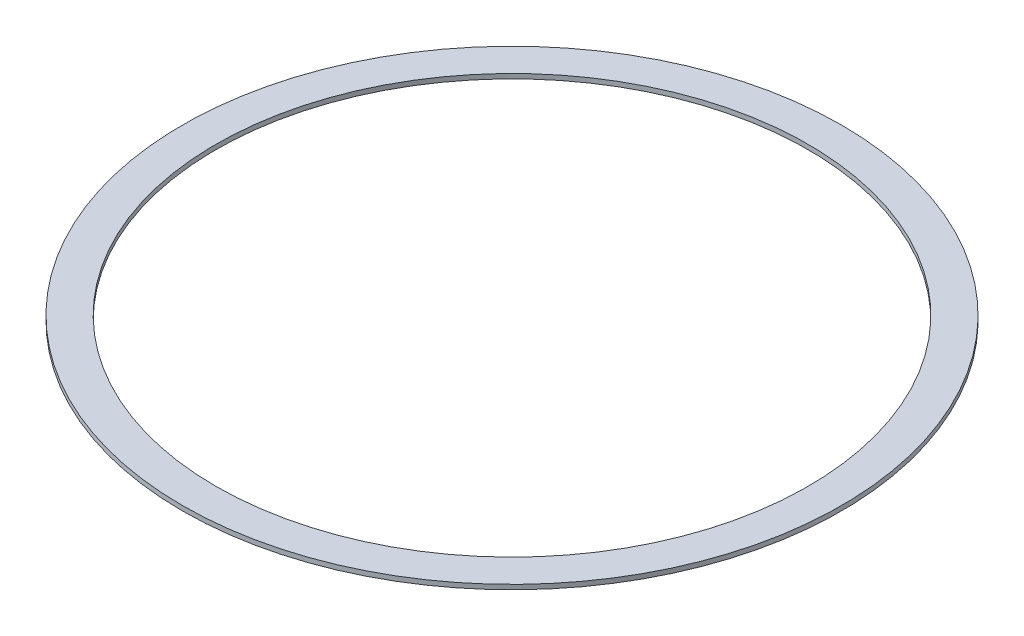
ISO-10303-21;
HEADER;
FILE_DESCRIPTION(('STEP AP214'),'2;1');
FILE_NAME('part.step','',(''),(''),'','','');
FILE_SCHEMA(('AUTOMOTIVE_DESIGN { 1 0 10303 214 1 1 1 1 }'));
ENDSEC;
DATA;
#1=APPLICATION_CONTEXT('core data for automotive mechanical design processes');
#2=APPLICATION_PROTOCOL_DEFINITION('international standard','automotive_design',2000,#1);
#3=PRODUCT_CONTEXT('',#1,'mechanical');
#4=PRODUCT('Part','Part','',(#3));
#5=PRODUCT_RELATED_PRODUCT_CATEGORY('part','',(#4));
#6=PRODUCT_DEFINITION_FORMATION('','',#4);
#7=PRODUCT_DEFINITION_CONTEXT('part definition',#1,'design');
#8=PRODUCT_DEFINITION('design','',#6,#7);
#9=PRODUCT_DEFINITION_SHAPE('','',#8);
#10=(LENGTH_UNIT() NAMED_UNIT(*) SI_UNIT(.MILLI.,.METRE.));
#11=(NAMED_UNIT(*) PLANE_ANGLE_UNIT() SI_UNIT($,.RADIAN.));
#12=(NAMED_UNIT(*) SI_UNIT($,.STERADIAN.) SOLID_ANGLE_UNIT());
#13=UNCERTAINTY_MEASURE_WITH_UNIT(LENGTH_MEASURE(1.E-05),#10,'distance_accuracy_value','');
#14=(GEOMETRIC_REPRESENTATION_CONTEXT(3) GLOBAL_UNCERTAINTY_ASSIGNED_CONTEXT((#13)) GLOBAL_UNIT_ASSIGNED_CONTEXT((#10,
#11,#12)) REPRESENTATION_CONTEXT('',''));
#15=CARTESIAN_POINT('',(0.,0.,0.));
#16=DIRECTION('',(0.,0.,1.));
#17=DIRECTION('',(1.,0.,0.));
#18=AXIS2_PLACEMENT_3D('',#15,#16,#17);
#19=CARTESIAN_POINT('',(0.,2.54,0.));
#20=DIRECTION('',(0.,1.,0.));
#21=DIRECTION('',(0.,0.,1.));
#22=AXIS2_PLACEMENT_3D('',#19,#20,#21);
#23=PLANE('',#22);
#24=CARTESIAN_POINT('',(0.,2.54,0.));
#25=DIRECTION('',(0.,1.,0.));
#26=DIRECTION('',(0.,0.,1.));
#27=AXIS2_PLACEMENT_3D('',#24,#25,#26);
#28=CIRCLE('',#27,179.0446);
#29=CARTESIAN_POINT('',(0.,2.54,179.0446));
#30=VERTEX_POINT('',#29);
#31=EDGE_CURVE('E10',#30,#30,#28,.T.);
#32=ORIENTED_EDGE('',*,*,#31,.T.);
#33=EDGE_LOOP('',(#32));
#34=FACE_BOUND('',#33,.T.);
#35=CARTESIAN_POINT('',(0.,2.54,0.));
#36=DIRECTION('',(0.,1.,0.));
#37=DIRECTION('',(0.,0.,1.));
#38=AXIS2_PLACEMENT_3D('',#35,#36,#37);
#39=CIRCLE('',#38,160.909);
#40=CARTESIAN_POINT('',(0.,2.54,160.909));
#41=VERTEX_POINT('',#40);
#42=EDGE_CURVE('E50',#41,#41,#39,.T.);
#43=ORIENTED_EDGE('',*,*,#42,.F.);
#44=EDGE_LOOP('',(#43));
#45=FACE_BOUND('',#44,.T.);
#46=ADVANCED_FACE('F39',(#34,#45),#23,.T.);
#47=CARTESIAN_POINT('',(0.,0.,0.));
#48=DIRECTION('',(0.,1.,0.));
#49=DIRECTION('',(0.,0.,1.));
#50=AXIS2_PLACEMENT_3D('',#47,#48,#49);
#51=PLANE('',#50);
#52=CARTESIAN_POINT('',(0.,0.,0.));
#53=DIRECTION('',(0.,1.,0.));
#54=DIRECTION('',(0.,0.,1.));
#55=AXIS2_PLACEMENT_3D('',#52,#53,#54);
#56=CIRCLE('',#55,179.0446);
#57=CARTESIAN_POINT('',(0.,0.,179.0446));
#58=VERTEX_POINT('',#57);
#59=EDGE_CURVE('E43',#58,#58,#56,.T.);
#60=ORIENTED_EDGE('',*,*,#59,.F.);
#61=EDGE_LOOP('',(#60));
#62=FACE_BOUND('',#61,.T.);
#63=CARTESIAN_POINT('',(0.,0.,0.));
#64=DIRECTION('',(0.,1.,0.));
#65=DIRECTION('',(0.,0.,1.));
#66=AXIS2_PLACEMENT_3D('',#63,#64,#65);
#67=CIRCLE('',#66,160.909);
#68=CARTESIAN_POINT('',(0.,0.,160.909));
#69=VERTEX_POINT('',#68);
#70=EDGE_CURVE('E52',#69,#69,#67,.T.);
#71=ORIENTED_EDGE('',*,*,#70,.T.);
#72=EDGE_LOOP('',(#71));
#73=FACE_BOUND('',#72,.T.);
#74=ADVANCED_FACE('F62',(#62,#73),#51,.F.);
#75=CARTESIAN_POINT('',(0.,2.54,0.));
#76=DIRECTION('',(0.,-1.,0.));
#77=DIRECTION('',(0.,0.,-1.));
#78=AXIS2_PLACEMENT_3D('',#75,#76,#77);
#79=CYLINDRICAL_SURFACE('',#78,179.0446);
#80=ORIENTED_EDGE('',*,*,#31,.F.);
#81=EDGE_LOOP('',(#80));
#82=FACE_BOUND('',#81,.T.);
#83=ORIENTED_EDGE('',*,*,#59,.T.);
#84=EDGE_LOOP('',(#83));
#85=FACE_BOUND('',#84,.T.);
#86=ADVANCED_FACE('F41',(#82,#85),#79,.T.);
#87=CARTESIAN_POINT('',(0.,2.54,0.));
#88=DIRECTION('',(0.,-1.,0.));
#89=DIRECTION('',(0.,0.,-1.));
#90=AXIS2_PLACEMENT_3D('',#87,#88,#89);
#91=CYLINDRICAL_SURFACE('',#90,160.909);
#92=ORIENTED_EDGE('',*,*,#42,.T.);
#93=EDGE_LOOP('',(#92));
#94=FACE_BOUND('',#93,.T.);
#95=ORIENTED_EDGE('',*,*,#70,.F.);
#96=EDGE_LOOP('',(#95));
#97=FACE_BOUND('',#96,.T.);
#98=ADVANCED_FACE('F58',(#94,#97),#91,.F.);
#99=CLOSED_SHELL('',(#46,#74,#86,#98));
#100=MANIFOLD_SOLID_BREP('B2',#99);
#101=ADVANCED_BREP_SHAPE_REPRESENTATION('',(#18,#100),#14);
#102=SHAPE_DEFINITION_REPRESENTATION(#9,#101);
ENDSEC;
END-ISO-10303-21;
